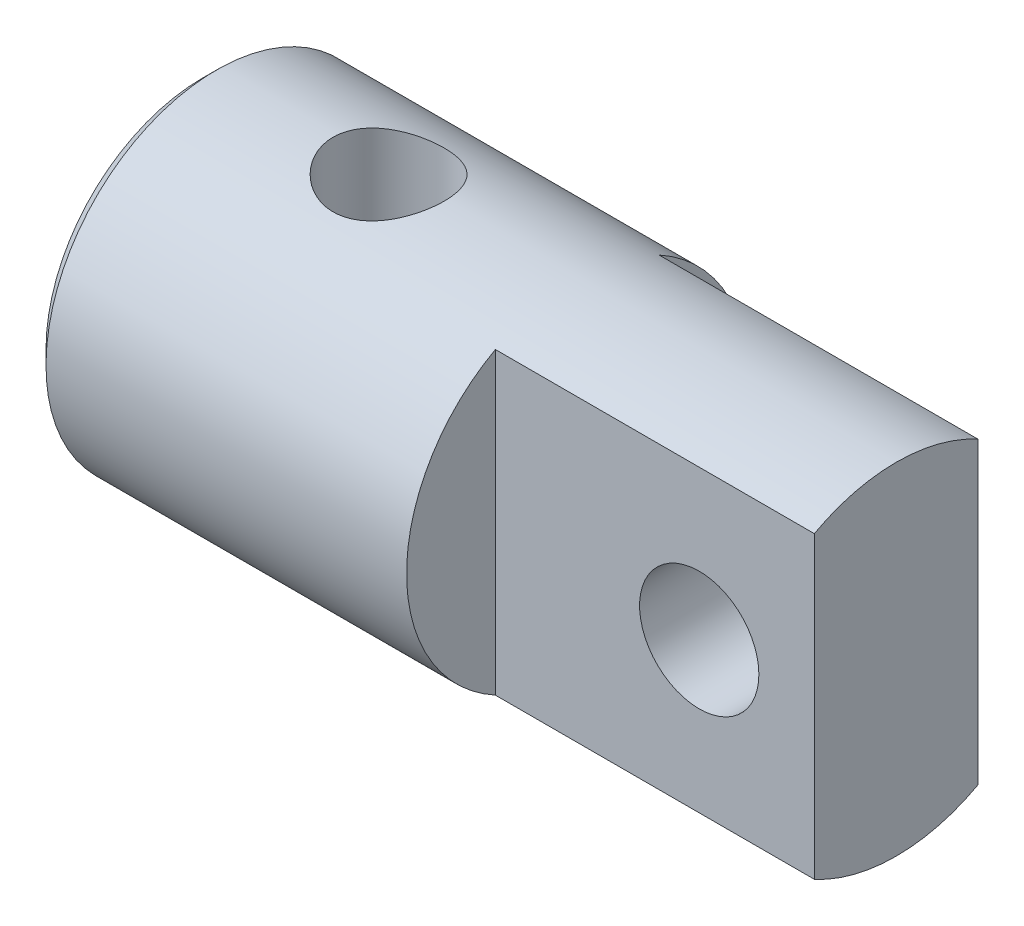
ISO-10303-21;
HEADER;
FILE_DESCRIPTION(('STEP AP214'),'2;1');
FILE_NAME('part.step','',(''),(''),'','','');
FILE_SCHEMA(('AUTOMOTIVE_DESIGN { 1 0 10303 214 1 1 1 1 }'));
ENDSEC;
DATA;
#1=APPLICATION_CONTEXT('core data for automotive mechanical design processes');
#2=APPLICATION_PROTOCOL_DEFINITION('international standard','automotive_design',2000,#1);
#3=PRODUCT_CONTEXT('',#1,'mechanical');
#4=PRODUCT('Part','Part','',(#3));
#5=PRODUCT_RELATED_PRODUCT_CATEGORY('part','',(#4));
#6=PRODUCT_DEFINITION_FORMATION('','',#4);
#7=PRODUCT_DEFINITION_CONTEXT('part definition',#1,'design');
#8=PRODUCT_DEFINITION('design','',#6,#7);
#9=PRODUCT_DEFINITION_SHAPE('','',#8);
#10=(LENGTH_UNIT() NAMED_UNIT(*) SI_UNIT(.MILLI.,.METRE.));
#11=(NAMED_UNIT(*) PLANE_ANGLE_UNIT() SI_UNIT($,.RADIAN.));
#12=(NAMED_UNIT(*) SI_UNIT($,.STERADIAN.) SOLID_ANGLE_UNIT());
#13=UNCERTAINTY_MEASURE_WITH_UNIT(LENGTH_MEASURE(1.E-05),#10,'distance_accuracy_value','');
#14=(GEOMETRIC_REPRESENTATION_CONTEXT(3) GLOBAL_UNCERTAINTY_ASSIGNED_CONTEXT((#13)) GLOBAL_UNIT_ASSIGNED_CONTEXT((#10,
#11,#12)) REPRESENTATION_CONTEXT('',''));
#15=CARTESIAN_POINT('',(0.,0.,0.));
#16=DIRECTION('',(0.,0.,1.));
#17=DIRECTION('',(1.,0.,0.));
#18=AXIS2_PLACEMENT_3D('',#15,#16,#17);
#19=CARTESIAN_POINT('',(0.,0.,0.));
#20=DIRECTION('',(-1.,0.,0.));
#21=DIRECTION('',(0.,-1.,0.));
#22=AXIS2_PLACEMENT_3D('',#19,#20,#21);
#23=PLANE('',#22);
#24=CARTESIAN_POINT('',(0.,0.,0.));
#25=DIRECTION('',(-1.,0.,0.));
#26=DIRECTION('',(0.,-1.,0.));
#27=AXIS2_PLACEMENT_3D('',#24,#25,#26);
#28=CIRCLE('',#27,5.65000000000001);
#29=CARTESIAN_POINT('',(0.,-5.65000000000001,0.));
#30=VERTEX_POINT('',#29);
#31=EDGE_CURVE('E110',#30,#30,#28,.T.);
#32=ORIENTED_EDGE('',*,*,#31,.T.);
#33=EDGE_LOOP('',(#32));
#34=FACE_BOUND('',#33,.T.);
#35=ADVANCED_FACE('F45',(#34),#23,.T.);
#36=CARTESIAN_POINT('',(25.,0.,0.));
#37=DIRECTION('',(1.,0.,0.));
#38=DIRECTION('',(0.,1.,0.));
#39=AXIS2_PLACEMENT_3D('',#36,#37,#38);
#40=CYLINDRICAL_SURFACE('',#39,6.15);
#41=DIRECTION('',(1.,0.,0.));
#42=VECTOR('',#41,1.);
#43=CARTESIAN_POINT('',(25.,-5.39629502529282,2.95));
#44=LINE('',#43,#42);
#45=CARTESIAN_POINT('',(13.5,-5.39629502529282,2.95));
#46=VERTEX_POINT('',#45);
#47=CARTESIAN_POINT('',(25.,-5.39629502529282,2.95));
#48=VERTEX_POINT('',#47);
#49=EDGE_CURVE('E70',#46,#48,#44,.T.);
#50=ORIENTED_EDGE('',*,*,#49,.F.);
#51=CARTESIAN_POINT('',(13.5,0.,0.));
#52=DIRECTION('',(-1.,0.,0.));
#53=DIRECTION('',(0.,0.,1.));
#54=AXIS2_PLACEMENT_3D('',#51,#52,#53);
#55=CIRCLE('',#54,6.15);
#56=CARTESIAN_POINT('',(13.5,5.39629502529282,2.95));
#57=VERTEX_POINT('',#56);
#58=EDGE_CURVE('E11',#57,#46,#55,.F.);
#59=ORIENTED_EDGE('',*,*,#58,.F.);
#60=DIRECTION('',(1.,0.,0.));
#61=VECTOR('',#60,1.);
#62=CARTESIAN_POINT('',(25.,5.39629502529282,2.95));
#63=LINE('',#62,#61);
#64=CARTESIAN_POINT('',(25.,5.39629502529282,2.95));
#65=VERTEX_POINT('',#64);
#66=EDGE_CURVE('E112',#65,#57,#63,.F.);
#67=ORIENTED_EDGE('',*,*,#66,.F.);
#68=CARTESIAN_POINT('',(25.,0.,0.));
#69=DIRECTION('',(1.,0.,0.));
#70=DIRECTION('',(0.,1.,0.));
#71=AXIS2_PLACEMENT_3D('',#68,#69,#70);
#72=CIRCLE('',#71,6.15);
#73=CARTESIAN_POINT('',(25.,5.39629502529282,-2.95));
#74=VERTEX_POINT('',#73);
#75=EDGE_CURVE('E107',#74,#65,#72,.T.);
#76=ORIENTED_EDGE('',*,*,#75,.F.);
#77=DIRECTION('',(1.,0.,0.));
#78=VECTOR('',#77,1.);
#79=CARTESIAN_POINT('',(25.,5.39629502529282,-2.95));
#80=LINE('',#79,#78);
#81=CARTESIAN_POINT('',(13.5,5.39629502529282,-2.95));
#82=VERTEX_POINT('',#81);
#83=EDGE_CURVE('E62',#82,#74,#80,.T.);
#84=ORIENTED_EDGE('',*,*,#83,.F.);
#85=CARTESIAN_POINT('',(13.5,0.,0.));
#86=DIRECTION('',(-1.,0.,0.));
#87=DIRECTION('',(0.,0.,1.));
#88=AXIS2_PLACEMENT_3D('',#85,#86,#87);
#89=CIRCLE('',#88,6.15);
#90=CARTESIAN_POINT('',(13.5,-5.39629502529282,-2.95));
#91=VERTEX_POINT('',#90);
#92=EDGE_CURVE('E55',#91,#82,#89,.F.);
#93=ORIENTED_EDGE('',*,*,#92,.F.);
#94=DIRECTION('',(1.,0.,0.));
#95=VECTOR('',#94,1.);
#96=CARTESIAN_POINT('',(25.,-5.39629502529282,-2.95));
#97=LINE('',#96,#95);
#98=CARTESIAN_POINT('',(25.,-5.39629502529282,-2.95));
#99=VERTEX_POINT('',#98);
#100=EDGE_CURVE('E90',#99,#91,#97,.F.);
#101=ORIENTED_EDGE('',*,*,#100,.F.);
#102=EDGE_CURVE('E103',#48,#99,#72,.T.);
#103=ORIENTED_EDGE('',*,*,#102,.F.);
#104=EDGE_LOOP('',(#50,#59,#67,#76,#84,#93,#101,#103));
#105=FACE_BOUND('',#104,.T.);
#106=CARTESIAN_POINT('',(8.7,-6.15,0.));
#107=CARTESIAN_POINT('',(8.69999999918456,-6.14999994316743,0.109275930693207));
#108=CARTESIAN_POINT('',(8.69101478689947,-6.14706039441532,0.218553009042241));
#109=CARTESIAN_POINT('',(8.65541503422324,-6.13562287657913,0.433897501147324));
#110=CARTESIAN_POINT('',(8.62879781509903,-6.12712406290922,0.53996442464157));
#111=CARTESIAN_POINT('',(8.55893653391903,-6.10549346049692,0.74575269807193));
#112=CARTESIAN_POINT('',(8.51571945591907,-6.09236919354333,0.845484041831606));
#113=CARTESIAN_POINT('',(8.4140043636421,-6.06283340640146,1.03628368026971));
#114=CARTESIAN_POINT('',(8.35550356817236,-6.0464212880466,1.12735039411839));
#115=CARTESIAN_POINT('',(8.22284275944753,-6.01143433741961,1.3012551696699));
#116=CARTESIAN_POINT('',(8.14826704611278,-5.99280953302418,1.38376601647632));
#117=CARTESIAN_POINT('',(7.9864576449676,-5.95577695826563,1.53535728777871));
#118=CARTESIAN_POINT('',(7.89922135258385,-5.93736923340537,1.60443494189804));
#119=CARTESIAN_POINT('',(7.71166633233093,-5.90231062733656,1.72902938898497));
#120=CARTESIAN_POINT('',(7.61105688801193,-5.88572095776574,1.78412743394196));
#121=CARTESIAN_POINT('',(7.40137312502201,-5.85693336531154,1.8764830969112));
#122=CARTESIAN_POINT('',(7.29230125851232,-5.84473417593086,1.91374586079228));
#123=CARTESIAN_POINT('',(7.07249874973717,-5.82663358868171,1.96815764676601));
#124=CARTESIAN_POINT('',(6.96193545195018,-5.82054151688846,1.98591741077448));
#125=CARTESIAN_POINT('',(6.73924348532818,-5.81478008345407,2.00272787957908));
#126=CARTESIAN_POINT('',(6.62711528241434,-5.8151088492414,2.00178403908881));
#127=CARTESIAN_POINT('',(6.40962198592103,-5.82198436694731,1.98168966805447));
#128=CARTESIAN_POINT('',(6.30417404880946,-5.82826175034559,1.96332783188451));
#129=CARTESIAN_POINT('',(6.09794562726857,-5.84588769045731,1.91020219381234));
#130=CARTESIAN_POINT('',(5.99716567800798,-5.85723682704939,1.87543651635236));
#131=CARTESIAN_POINT('',(5.80130771909277,-5.88392515838721,1.78995778071209));
#132=CARTESIAN_POINT('',(5.70634251897686,-5.8993235618603,1.73900552496647));
#133=CARTESIAN_POINT('',(5.52605698035539,-5.93234968935044,1.62276604270421));
#134=CARTESIAN_POINT('',(5.44073932840769,-5.94997803145844,1.55747483803217));
#135=CARTESIAN_POINT('',(5.27772799931394,-5.98654582877886,1.41059024512933));
#136=CARTESIAN_POINT('',(5.20062133154496,-6.00550697474612,1.32834952791472));
#137=CARTESIAN_POINT('',(5.06114501651304,-6.04183756472134,1.15187012886872));
#138=CARTESIAN_POINT('',(4.99877664963257,-6.05920687035879,1.05763040572332));
#139=CARTESIAN_POINT('',(4.89010485796254,-6.09060599620488,0.858628416343221));
#140=CARTESIAN_POINT('',(4.84395183230819,-6.10460419203387,0.753778689161372));
#141=CARTESIAN_POINT('',(4.77011773496595,-6.12745488449761,0.537240584659712));
#142=CARTESIAN_POINT('',(4.74243056876684,-6.13630907874501,0.425554476933183));
#143=CARTESIAN_POINT('',(4.70733814809986,-6.14759610653883,0.20348867170941));
#144=CARTESIAN_POINT('',(4.69913911953971,-6.15028010120748,0.0932470028804535));
#145=CARTESIAN_POINT('',(4.70100375189134,-6.14967343730454,-0.127054581731222));
#146=CARTESIAN_POINT('',(4.71106449693912,-6.14638373266011,-0.23711452372445));
#147=CARTESIAN_POINT('',(4.74853121045614,-6.13436483244421,-0.450797306096235));
#148=CARTESIAN_POINT('',(4.77545588326652,-6.12578667244889,-0.554513859273324));
#149=CARTESIAN_POINT('',(4.84529017306788,-6.10420761917996,-0.755921041977586));
#150=CARTESIAN_POINT('',(4.88820180697218,-6.09120616788237,-0.853610909365379));
#151=CARTESIAN_POINT('',(4.99001294648456,-6.06169349098342,-1.04297447933711));
#152=CARTESIAN_POINT('',(5.04929331544958,-6.04510099840299,-1.13443038855414));
#153=CARTESIAN_POINT('',(5.18170804542634,-6.01029415808353,-1.30635793269386));
#154=CARTESIAN_POINT('',(5.25484645353588,-5.99207933738582,-1.38682634699));
#155=CARTESIAN_POINT('',(5.41663526873055,-5.95508777066157,-1.5381026394857));
#156=CARTESIAN_POINT('',(5.50581862083697,-5.93632066803884,-1.60834423598373));
#157=CARTESIAN_POINT('',(5.69511199380083,-5.9011582089238,-1.73292705476389));
#158=CARTESIAN_POINT('',(5.79522199014971,-5.88476284711185,-1.78726831270961));
#159=CARTESIAN_POINT('',(6.00346269545166,-5.85637042602916,-1.87821793059078));
#160=CARTESIAN_POINT('',(6.11156968578748,-5.84436094149838,-1.9148764820769));
#161=CARTESIAN_POINT('',(6.33289908993628,-5.82624486525908,-1.96931713943731));
#162=CARTESIAN_POINT('',(6.44611932332632,-5.82013578188197,-1.98710721355488));
#163=CARTESIAN_POINT('',(6.66850124748932,-5.81478627230482,-2.00270348035457));
#164=CARTESIAN_POINT('',(6.77759035746587,-5.81522429976815,-2.00144515117492));
#165=CARTESIAN_POINT('',(6.99391803096077,-5.82213014541404,-1.98126517189426));
#166=CARTESIAN_POINT('',(7.10115669444375,-5.8285976368283,-1.9623444790094));
#167=CARTESIAN_POINT('',(7.30891359055838,-5.84659998232017,-1.90802517500685));
#168=CARTESIAN_POINT('',(7.40951566707675,-5.85804580286302,-1.87291545709127));
#169=CARTESIAN_POINT('',(7.60347977422412,-5.88468617459773,-1.78744596070577));
#170=CARTESIAN_POINT('',(7.69684024310082,-5.89988153149055,-1.7370829040664));
#171=CARTESIAN_POINT('',(7.8779062159699,-5.93310236799994,-1.62007323988053));
#172=CARTESIAN_POINT('',(7.96521121520167,-5.95121971302379,-1.55283307636114));
#173=CARTESIAN_POINT('',(8.12760110862251,-5.98784382663959,-1.40499751231745));
#174=CARTESIAN_POINT('',(8.20268261216619,-6.00635070168013,-1.32439841866179));
#175=CARTESIAN_POINT('',(8.34124251163947,-6.04247740884059,-1.14860592719474));
#176=CARTESIAN_POINT('',(8.40419887035284,-6.06004040500971,-1.0529879829512));
#177=CARTESIAN_POINT('',(8.51306951147034,-6.0915511319482,-0.851959033671659));
#178=CARTESIAN_POINT('',(8.55898910008644,-6.10549998795586,-0.746551090604265));
#179=CARTESIAN_POINT('',(8.62998889389919,-6.12750250239647,-0.535515183546198));
#180=CARTESIAN_POINT('',(8.65616243720957,-6.1358619381303,-0.430286887521659));
#181=CARTESIAN_POINT('',(8.6911658666282,-6.14711004512017,-0.21670558915028));
#182=CARTESIAN_POINT('',(8.70000000080856,-6.15000005635276,-0.108353358754766));
#183=CARTESIAN_POINT('',(8.7,-6.15,0.));
#184=B_SPLINE_CURVE_WITH_KNOTS('',3,(#106,#107,#108,#109,#110,#111,#112,#113,#114,#115,#116,
#117,#118,#119,#120,#121,#122,#123,#124,#125,#126,#127,#128,#129,#130,#131,#132,#133,#134,#135,
#136,#137,#138,#139,#140,#141,#142,#143,#144,#145,#146,#147,#148,#149,#150,#151,#152,#153,#154,
#155,#156,#157,#158,#159,#160,#161,#162,#163,#164,#165,#166,#167,#168,#169,#170,#171,#172,#173,
#174,#175,#176,#177,#178,#179,#180,#181,#182,#183),.UNSPECIFIED.,.T.,.F.,(4,2,2,2,2,2,2,2,2,2,2,
2,2,2,2,2,2,2,2,2,2,2,2,2,2,2,2,2,2,2,2,2,2,2,2,2,2,2,4),(0.,0.327429241558711,
0.654908239039127,0.981857137585752,1.30886557282721,1.64564590746146,1.98249562405249,
2.32848403735761,2.67437256517015,3.00908998892277,3.34370979722347,3.66386663909209,
3.98406009544642,4.30922442381609,4.63447907903296,4.97584543559233,5.31724143728842,
5.66172515239416,6.00609511703097,6.33617834333708,6.66620886399989,6.98722451861792,
7.30828068625916,7.63754882455277,7.96691327084462,8.31048192972342,8.65404981799052,
8.99663668064053,9.33907880963433,9.66476038654692,9.990424314091,10.3104891889731,
10.630622899429,10.9641620680002,11.2977935991217,11.6435733073037,11.9892452295767,
12.3139896908906,12.6386545814329),.UNSPECIFIED.);
#185=CARTESIAN_POINT('',(8.7,-6.15,0.));
#186=VERTEX_POINT('',#185);
#187=EDGE_CURVE('E97',#186,#186,#184,.T.);
#188=ORIENTED_EDGE('',*,*,#187,.F.);
#189=EDGE_LOOP('',(#188));
#190=FACE_BOUND('',#189,.T.);
#191=CARTESIAN_POINT('',(4.7,6.15,0.));
#192=CARTESIAN_POINT('',(4.70000000081544,6.14999994316743,0.109275930693207));
#193=CARTESIAN_POINT('',(4.70898521310053,6.14706039441532,0.218553009042241));
#194=CARTESIAN_POINT('',(4.74458496577676,6.13562287657913,0.433897501147324));
#195=CARTESIAN_POINT('',(4.77120218490097,6.12712406290922,0.53996442464157));
#196=CARTESIAN_POINT('',(4.84106346608097,6.10549346049692,0.74575269807193));
#197=CARTESIAN_POINT('',(4.88428054408093,6.09236919354333,0.845484041831605));
#198=CARTESIAN_POINT('',(4.9859956363579,6.06283340640146,1.03628368026971));
#199=CARTESIAN_POINT('',(5.04449643182763,6.0464212880466,1.12735039411839));
#200=CARTESIAN_POINT('',(5.17715724055247,6.01143433741961,1.3012551696699));
#201=CARTESIAN_POINT('',(5.25173295388722,5.99280953302417,1.38376601647632));
#202=CARTESIAN_POINT('',(5.4135423550324,5.95577695826563,1.53535728777871));
#203=CARTESIAN_POINT('',(5.50077864741615,5.93736923340537,1.60443494189804));
#204=CARTESIAN_POINT('',(5.68833366766907,5.90231062733656,1.72902938898497));
#205=CARTESIAN_POINT('',(5.78894311198807,5.88572095776574,1.78412743394196));
#206=CARTESIAN_POINT('',(5.99862687497799,5.85693336531154,1.8764830969112));
#207=CARTESIAN_POINT('',(6.10769874148768,5.84473417593086,1.91374586079228));
#208=CARTESIAN_POINT('',(6.32750125026283,5.82663358868171,1.96815764676601));
#209=CARTESIAN_POINT('',(6.43806454804982,5.82054151688846,1.98591741077448));
#210=CARTESIAN_POINT('',(6.66075651467182,5.81478008345407,2.00272787957908));
#211=CARTESIAN_POINT('',(6.77288471758566,5.8151088492414,2.00178403908881));
#212=CARTESIAN_POINT('',(6.99037801407897,5.82198436694731,1.98168966805447));
#213=CARTESIAN_POINT('',(7.09582595119054,5.82826175034559,1.96332783188451));
#214=CARTESIAN_POINT('',(7.30205437273143,5.84588769045731,1.91020219381234));
#215=CARTESIAN_POINT('',(7.40283432199202,5.85723682704939,1.87543651635236));
#216=CARTESIAN_POINT('',(7.59869228090723,5.88392515838721,1.78995778071209));
#217=CARTESIAN_POINT('',(7.69365748102314,5.8993235618603,1.73900552496647));
#218=CARTESIAN_POINT('',(7.87394301964461,5.93234968935044,1.62276604270421));
#219=CARTESIAN_POINT('',(7.95926067159231,5.94997803145844,1.55747483803217));
#220=CARTESIAN_POINT('',(8.12227200068606,5.98654582877886,1.41059024512933));
#221=CARTESIAN_POINT('',(8.19937866845504,6.00550697474612,1.32834952791472));
#222=CARTESIAN_POINT('',(8.33885498348696,6.04183756472134,1.15187012886872));
#223=CARTESIAN_POINT('',(8.40122335036743,6.05920687035879,1.05763040572332));
#224=CARTESIAN_POINT('',(8.50989514203746,6.09060599620488,0.858628416343221));
#225=CARTESIAN_POINT('',(8.55604816769181,6.10460419203387,0.753778689161372));
#226=CARTESIAN_POINT('',(8.62988226503405,6.12745488449761,0.537240584659712));
#227=CARTESIAN_POINT('',(8.65756943123317,6.13630907874501,0.425554476933183));
#228=CARTESIAN_POINT('',(8.69266185190014,6.14759610653883,0.20348867170941));
#229=CARTESIAN_POINT('',(8.70086088046029,6.15028010120748,0.0932470028804535));
#230=CARTESIAN_POINT('',(8.69899624810866,6.14967343730454,-0.127054581731222));
#231=CARTESIAN_POINT('',(8.68893550306088,6.14638373266011,-0.23711452372445));
#232=CARTESIAN_POINT('',(8.65146878954386,6.13436483244421,-0.450797306096234));
#233=CARTESIAN_POINT('',(8.62454411673347,6.12578667244889,-0.554513859273324));
#234=CARTESIAN_POINT('',(8.55470982693212,6.10420761917996,-0.755921041977586));
#235=CARTESIAN_POINT('',(8.51179819302782,6.09120616788237,-0.853610909365378));
#236=CARTESIAN_POINT('',(8.40998705351544,6.06169349098342,-1.04297447933711));
#237=CARTESIAN_POINT('',(8.35070668455042,6.04510099840299,-1.13443038855414));
#238=CARTESIAN_POINT('',(8.21829195457367,6.01029415808353,-1.30635793269386));
#239=CARTESIAN_POINT('',(8.14515354646412,5.99207933738582,-1.38682634699));
#240=CARTESIAN_POINT('',(7.98336473126945,5.95508777066157,-1.5381026394857));
#241=CARTESIAN_POINT('',(7.89418137916303,5.93632066803884,-1.60834423598373));
#242=CARTESIAN_POINT('',(7.70488800619917,5.9011582089238,-1.73292705476389));
#243=CARTESIAN_POINT('',(7.60477800985029,5.88476284711185,-1.78726831270961));
#244=CARTESIAN_POINT('',(7.39653730454834,5.85637042602916,-1.87821793059078));
#245=CARTESIAN_POINT('',(7.28843031421252,5.84436094149838,-1.9148764820769));
#246=CARTESIAN_POINT('',(7.06710091006372,5.82624486525909,-1.96931713943731));
#247=CARTESIAN_POINT('',(6.95388067667368,5.82013578188197,-1.98710721355488));
#248=CARTESIAN_POINT('',(6.73149875251069,5.81478627230482,-2.00270348035457));
#249=CARTESIAN_POINT('',(6.62240964253413,5.81522429976815,-2.00144515117492));
#250=CARTESIAN_POINT('',(6.40608196903923,5.82213014541404,-1.98126517189426));
#251=CARTESIAN_POINT('',(6.29884330555625,5.8285976368283,-1.9623444790094));
#252=CARTESIAN_POINT('',(6.09108640944162,5.84659998232017,-1.90802517500685));
#253=CARTESIAN_POINT('',(5.99048433292325,5.85804580286302,-1.87291545709127));
#254=CARTESIAN_POINT('',(5.79652022577588,5.88468617459773,-1.78744596070577));
#255=CARTESIAN_POINT('',(5.70315975689918,5.89988153149055,-1.7370829040664));
#256=CARTESIAN_POINT('',(5.52209378403011,5.93310236799994,-1.62007323988053));
#257=CARTESIAN_POINT('',(5.43478878479833,5.95121971302379,-1.55283307636114));
#258=CARTESIAN_POINT('',(5.27239889137749,5.98784382663959,-1.40499751231746));
#259=CARTESIAN_POINT('',(5.19731738783381,6.00635070168013,-1.32439841866179));
#260=CARTESIAN_POINT('',(5.05875748836054,6.04247740884059,-1.14860592719474));
#261=CARTESIAN_POINT('',(4.99580112964717,6.06004040500971,-1.0529879829512));
#262=CARTESIAN_POINT('',(4.88693048852966,6.0915511319482,-0.851959033671659));
#263=CARTESIAN_POINT('',(4.84101089991356,6.10549998795586,-0.746551090604265));
#264=CARTESIAN_POINT('',(4.77001110610081,6.12750250239647,-0.535515183546198));
#265=CARTESIAN_POINT('',(4.74383756279043,6.1358619381303,-0.430286887521658));
#266=CARTESIAN_POINT('',(4.7088341333718,6.14711004512016,-0.216705589150279));
#267=CARTESIAN_POINT('',(4.69999999919145,6.15000005635276,-0.108353358754766));
#268=CARTESIAN_POINT('',(4.7,6.15,0.));
#269=B_SPLINE_CURVE_WITH_KNOTS('',3,(#191,#192,#193,#194,#195,#196,#197,#198,#199,#200,#201,
#202,#203,#204,#205,#206,#207,#208,#209,#210,#211,#212,#213,#214,#215,#216,#217,#218,#219,#220,
#221,#222,#223,#224,#225,#226,#227,#228,#229,#230,#231,#232,#233,#234,#235,#236,#237,#238,#239,
#240,#241,#242,#243,#244,#245,#246,#247,#248,#249,#250,#251,#252,#253,#254,#255,#256,#257,#258,
#259,#260,#261,#262,#263,#264,#265,#266,#267,#268),.UNSPECIFIED.,.T.,.F.,(4,2,2,2,2,2,2,2,2,2,2,
2,2,2,2,2,2,2,2,2,2,2,2,2,2,2,2,2,2,2,2,2,2,2,2,2,2,2,4),(0.,0.327429241558711,
0.654908239039127,0.981857137585751,1.30886557282721,1.64564590746146,1.9824956240525,
2.32848403735761,2.67437256517015,3.00908998892277,3.34370979722347,3.66386663909209,
3.98406009544642,4.30922442381609,4.63447907903296,4.97584543559233,5.31724143728842,
5.66172515239416,6.00609511703097,6.33617834333708,6.66620886399989,6.98722451861792,
7.30828068625916,7.63754882455277,7.96691327084462,8.31048192972342,8.65404981799053,
8.99663668064054,9.33907880963433,9.66476038654692,9.990424314091,10.3104891889731,
10.630622899429,10.9641620680002,11.2977935991217,11.6435733073037,11.9892452295767,
12.3139896908906,12.6386545814329),.UNSPECIFIED.);
#270=CARTESIAN_POINT('',(4.7,6.15,0.));
#271=VERTEX_POINT('',#270);
#272=EDGE_CURVE('E118',#271,#271,#269,.T.);
#273=ORIENTED_EDGE('',*,*,#272,.F.);
#274=EDGE_LOOP('',(#273));
#275=FACE_BOUND('',#274,.T.);
#276=CARTESIAN_POINT('',(0.499999999999997,0.,0.));
#277=DIRECTION('',(-1.,0.,0.));
#278=DIRECTION('',(0.,-1.,0.));
#279=AXIS2_PLACEMENT_3D('',#276,#277,#278);
#280=CIRCLE('',#279,6.15);
#281=CARTESIAN_POINT('',(0.499999999999997,-6.15,0.));
#282=VERTEX_POINT('',#281);
#283=EDGE_CURVE('E106',#282,#282,#280,.F.);
#284=ORIENTED_EDGE('',*,*,#283,.T.);
#285=EDGE_LOOP('',(#284));
#286=FACE_BOUND('',#285,.T.);
#287=ADVANCED_FACE('F101',(#105,#190,#275,#286),#40,.T.);
#288=CARTESIAN_POINT('',(25.,6.15,0.));
#289=DIRECTION('',(1.,0.,0.));
#290=DIRECTION('',(0.,1.,0.));
#291=AXIS2_PLACEMENT_3D('',#288,#289,#290);
#292=PLANE('',#291);
#293=DIRECTION('',(0.,1.,0.));
#294=VECTOR('',#293,1.);
#295=CARTESIAN_POINT('',(25.,6.15,2.95));
#296=LINE('',#295,#294);
#297=EDGE_CURVE('E96',#48,#65,#296,.T.);
#298=ORIENTED_EDGE('',*,*,#297,.F.);
#299=ORIENTED_EDGE('',*,*,#102,.T.);
#300=DIRECTION('',(0.,-1.,0.));
#301=VECTOR('',#300,1.);
#302=CARTESIAN_POINT('',(25.,6.15,-2.95));
#303=LINE('',#302,#301);
#304=EDGE_CURVE('E87',#74,#99,#303,.T.);
#305=ORIENTED_EDGE('',*,*,#304,.F.);
#306=ORIENTED_EDGE('',*,*,#75,.T.);
#307=EDGE_LOOP('',(#298,#299,#305,#306));
#308=FACE_BOUND('',#307,.T.);
#309=ADVANCED_FACE('F105',(#308),#292,.T.);
#310=CARTESIAN_POINT('',(0.499999999999997,0.,0.));
#311=DIRECTION('',(1.,0.,0.));
#312=DIRECTION('',(0.,1.,0.));
#313=AXIS2_PLACEMENT_3D('',#310,#311,#312);
#314=CONICAL_SURFACE('',#313,6.15,0.785398163397447);
#315=ORIENTED_EDGE('',*,*,#31,.F.);
#316=EDGE_LOOP('',(#315));
#317=FACE_BOUND('',#316,.T.);
#318=ORIENTED_EDGE('',*,*,#283,.F.);
#319=EDGE_LOOP('',(#318));
#320=FACE_BOUND('',#319,.T.);
#321=ADVANCED_FACE('F48',(#317,#320),#314,.T.);
#322=CARTESIAN_POINT('',(6.7,-6.15,0.));
#323=DIRECTION('',(0.,1.,0.));
#324=DIRECTION('',(0.,0.,1.));
#325=AXIS2_PLACEMENT_3D('',#322,#323,#324);
#326=CYLINDRICAL_SURFACE('',#325,2.);
#327=ORIENTED_EDGE('',*,*,#272,.T.);
#328=EDGE_LOOP('',(#327));
#329=FACE_BOUND('',#328,.T.);
#330=ORIENTED_EDGE('',*,*,#187,.T.);
#331=EDGE_LOOP('',(#330));
#332=FACE_BOUND('',#331,.T.);
#333=ADVANCED_FACE('F131',(#329,#332),#326,.F.);
#334=CARTESIAN_POINT('',(13.5,-6.15,-6.15));
#335=DIRECTION('',(-1.,0.,0.));
#336=DIRECTION('',(0.,0.,1.));
#337=AXIS2_PLACEMENT_3D('',#334,#335,#336);
#338=PLANE('',#337);
#339=DIRECTION('',(0.,1.,0.));
#340=VECTOR('',#339,1.);
#341=CARTESIAN_POINT('',(13.5,-6.15,-2.95));
#342=LINE('',#341,#340);
#343=EDGE_CURVE('E230',#91,#82,#342,.T.);
#344=ORIENTED_EDGE('',*,*,#343,.F.);
#345=ORIENTED_EDGE('',*,*,#92,.T.);
#346=EDGE_LOOP('',(#344,#345));
#347=FACE_BOUND('',#346,.T.);
#348=ADVANCED_FACE('F135',(#347),#338,.F.);
#349=CARTESIAN_POINT('',(13.5,-6.15,-2.95));
#350=DIRECTION('',(0.,0.,1.));
#351=DIRECTION('',(1.,0.,0.));
#352=AXIS2_PLACEMENT_3D('',#349,#350,#351);
#353=PLANE('',#352);
#354=CARTESIAN_POINT('',(20.85,0.,-2.95));
#355=DIRECTION('',(0.,0.,1.));
#356=DIRECTION('',(1.,0.,0.));
#357=AXIS2_PLACEMENT_3D('',#354,#355,#356);
#358=CIRCLE('',#357,2.15);
#359=CARTESIAN_POINT('',(23.,0.,-2.95));
#360=VERTEX_POINT('',#359);
#361=EDGE_CURVE('E229',#360,#360,#358,.T.);
#362=ORIENTED_EDGE('',*,*,#361,.T.);
#363=EDGE_LOOP('',(#362));
#364=FACE_BOUND('',#363,.T.);
#365=ORIENTED_EDGE('',*,*,#100,.T.);
#366=ORIENTED_EDGE('',*,*,#343,.T.);
#367=ORIENTED_EDGE('',*,*,#83,.T.);
#368=ORIENTED_EDGE('',*,*,#304,.T.);
#369=EDGE_LOOP('',(#365,#366,#367,#368));
#370=FACE_BOUND('',#369,.T.);
#371=ADVANCED_FACE('F89',(#364,#370),#353,.F.);
#372=CARTESIAN_POINT('',(13.5,-6.15,6.15));
#373=DIRECTION('',(-1.,0.,0.));
#374=DIRECTION('',(0.,0.,1.));
#375=AXIS2_PLACEMENT_3D('',#372,#373,#374);
#376=PLANE('',#375);
#377=ORIENTED_EDGE('',*,*,#58,.T.);
#378=DIRECTION('',(0.,1.,0.));
#379=VECTOR('',#378,1.);
#380=CARTESIAN_POINT('',(13.5,-6.15,2.95));
#381=LINE('',#380,#379);
#382=EDGE_CURVE('E232',#46,#57,#381,.T.);
#383=ORIENTED_EDGE('',*,*,#382,.T.);
#384=EDGE_LOOP('',(#377,#383));
#385=FACE_BOUND('',#384,.T.);
#386=ADVANCED_FACE('F190',(#385),#376,.F.);
#387=CARTESIAN_POINT('',(13.5,-6.15,2.95));
#388=DIRECTION('',(0.,0.,-1.));
#389=DIRECTION('',(-1.,0.,0.));
#390=AXIS2_PLACEMENT_3D('',#387,#388,#389);
#391=PLANE('',#390);
#392=CARTESIAN_POINT('',(20.85,0.,2.95));
#393=DIRECTION('',(0.,0.,-1.));
#394=DIRECTION('',(-1.,0.,0.));
#395=AXIS2_PLACEMENT_3D('',#392,#393,#394);
#396=CIRCLE('',#395,2.15);
#397=CARTESIAN_POINT('',(23.,0.,2.95));
#398=VERTEX_POINT('',#397);
#399=EDGE_CURVE('E50',#398,#398,#396,.T.);
#400=ORIENTED_EDGE('',*,*,#399,.T.);
#401=EDGE_LOOP('',(#400));
#402=FACE_BOUND('',#401,.T.);
#403=ORIENTED_EDGE('',*,*,#66,.T.);
#404=ORIENTED_EDGE('',*,*,#382,.F.);
#405=ORIENTED_EDGE('',*,*,#49,.T.);
#406=ORIENTED_EDGE('',*,*,#297,.T.);
#407=EDGE_LOOP('',(#403,#404,#405,#406));
#408=FACE_BOUND('',#407,.T.);
#409=ADVANCED_FACE('F198',(#402,#408),#391,.F.);
#410=CARTESIAN_POINT('',(20.85,0.,-6.15));
#411=DIRECTION('',(0.,0.,1.));
#412=DIRECTION('',(1.,0.,0.));
#413=AXIS2_PLACEMENT_3D('',#410,#411,#412);
#414=CYLINDRICAL_SURFACE('',#413,2.15);
#415=CARTESIAN_POINT('',(23.,0.,2.95));
#416=CARTESIAN_POINT('',(23.,0.,2.88854166666667));
#417=CARTESIAN_POINT('',(23.,0.,2.82708333333333));
#418=CARTESIAN_POINT('',(23.,0.,2.70416666666667));
#419=CARTESIAN_POINT('',(23.,0.,2.64270833333333));
#420=CARTESIAN_POINT('',(23.,0.,2.51979166666667));
#421=CARTESIAN_POINT('',(23.,0.,2.45833333333333));
#422=CARTESIAN_POINT('',(23.,0.,2.33541666666667));
#423=CARTESIAN_POINT('',(23.,0.,2.27395833333333));
#424=CARTESIAN_POINT('',(23.,0.,2.15104166666667));
#425=CARTESIAN_POINT('',(23.,0.,2.08958333333333));
#426=CARTESIAN_POINT('',(23.,0.,1.96666666666667));
#427=CARTESIAN_POINT('',(23.,0.,1.90520833333333));
#428=CARTESIAN_POINT('',(23.,0.,1.78229166666667));
#429=CARTESIAN_POINT('',(23.,0.,1.72083333333333));
#430=CARTESIAN_POINT('',(23.,0.,1.59791666666667));
#431=CARTESIAN_POINT('',(23.,0.,1.53645833333333));
#432=CARTESIAN_POINT('',(23.,0.,1.41354166666667));
#433=CARTESIAN_POINT('',(23.,0.,1.35208333333333));
#434=CARTESIAN_POINT('',(23.,0.,1.22916666666667));
#435=CARTESIAN_POINT('',(23.,0.,1.16770833333333));
#436=CARTESIAN_POINT('',(23.,0.,1.04479166666667));
#437=CARTESIAN_POINT('',(23.,0.,0.983333333333334));
#438=CARTESIAN_POINT('',(23.,0.,0.860416666666667));
#439=CARTESIAN_POINT('',(23.,0.,0.798958333333334));
#440=CARTESIAN_POINT('',(23.,0.,0.676041666666667));
#441=CARTESIAN_POINT('',(23.,0.,0.614583333333334));
#442=CARTESIAN_POINT('',(23.,0.,0.491666666666667));
#443=CARTESIAN_POINT('',(23.,0.,0.430208333333334));
#444=CARTESIAN_POINT('',(23.,0.,0.307291666666667));
#445=CARTESIAN_POINT('',(23.,0.,0.245833333333333));
#446=CARTESIAN_POINT('',(23.,0.,0.122916666666666));
#447=CARTESIAN_POINT('',(23.,0.,0.0614583333333332));
#448=CARTESIAN_POINT('',(23.,0.,-0.0614583333333332));
#449=CARTESIAN_POINT('',(23.,0.,-0.122916666666666));
#450=CARTESIAN_POINT('',(23.,0.,-0.245833333333333));
#451=CARTESIAN_POINT('',(23.,0.,-0.307291666666667));
#452=CARTESIAN_POINT('',(23.,0.,-0.430208333333334));
#453=CARTESIAN_POINT('',(23.,0.,-0.491666666666667));
#454=CARTESIAN_POINT('',(23.,0.,-0.614583333333334));
#455=CARTESIAN_POINT('',(23.,0.,-0.676041666666667));
#456=CARTESIAN_POINT('',(23.,0.,-0.798958333333334));
#457=CARTESIAN_POINT('',(23.,0.,-0.860416666666667));
#458=CARTESIAN_POINT('',(23.,0.,-0.983333333333334));
#459=CARTESIAN_POINT('',(23.,0.,-1.04479166666667));
#460=CARTESIAN_POINT('',(23.,0.,-1.16770833333333));
#461=CARTESIAN_POINT('',(23.,0.,-1.22916666666667));
#462=CARTESIAN_POINT('',(23.,0.,-1.35208333333333));
#463=CARTESIAN_POINT('',(23.,0.,-1.41354166666667));
#464=CARTESIAN_POINT('',(23.,0.,-1.53645833333333));
#465=CARTESIAN_POINT('',(23.,0.,-1.59791666666667));
#466=CARTESIAN_POINT('',(23.,0.,-1.72083333333333));
#467=CARTESIAN_POINT('',(23.,0.,-1.78229166666667));
#468=CARTESIAN_POINT('',(23.,0.,-1.90520833333333));
#469=CARTESIAN_POINT('',(23.,0.,-1.96666666666667));
#470=CARTESIAN_POINT('',(23.,0.,-2.08958333333333));
#471=CARTESIAN_POINT('',(23.,0.,-2.15104166666667));
#472=CARTESIAN_POINT('',(23.,0.,-2.27395833333334));
#473=CARTESIAN_POINT('',(23.,0.,-2.33541666666667));
#474=CARTESIAN_POINT('',(23.,0.,-2.45833333333333));
#475=CARTESIAN_POINT('',(23.,0.,-2.51979166666667));
#476=CARTESIAN_POINT('',(23.,0.,-2.64270833333333));
#477=CARTESIAN_POINT('',(23.,0.,-2.70416666666667));
#478=CARTESIAN_POINT('',(23.,0.,-2.82708333333333));
#479=CARTESIAN_POINT('',(23.,0.,-2.88854166666667));
#480=CARTESIAN_POINT('',(23.,0.,-2.95));
#481=B_SPLINE_CURVE_WITH_KNOTS('',3,(#415,#416,#417,#418,#419,#420,#421,#422,#423,#424,#425,
#426,#427,#428,#429,#430,#431,#432,#433,#434,#435,#436,#437,#438,#439,#440,#441,#442,#443,#444,
#445,#446,#447,#448,#449,#450,#451,#452,#453,#454,#455,#456,#457,#458,#459,#460,#461,#462,#463,
#464,#465,#466,#467,#468,#469,#470,#471,#472,#473,#474,#475,#476,#477,#478,#479,#480),
.UNSPECIFIED.,.F.,.F.,(4,2,2,2,2,2,2,2,2,2,2,2,2,2,2,2,2,2,2,2,2,2,2,2,2,2,2,2,2,2,2,2,4),(0.,
0.184375000000001,0.368750000000001,0.553125,0.7375,0.921875000000001,1.10625,1.290625,1.475,
1.659375,1.84375,2.028125,2.2125,2.396875,2.58125,2.765625,2.95,3.134375,3.31875,3.503125,
3.6875,3.871875,4.05625,4.240625,4.425,4.609375,4.79375,4.978125,5.1625,5.346875,5.53125,
5.715625,5.9),.UNSPECIFIED.);
#482=EDGE_CURVE('BSEAM207',#398,#360,#481,.T.);
#483=ORIENTED_EDGE('',*,*,#399,.F.);
#484=ORIENTED_EDGE('',*,*,#361,.F.);
#485=ORIENTED_EDGE('',*,*,#482,.T.);
#486=ORIENTED_EDGE('',*,*,#482,.F.);
#487=EDGE_LOOP('',(#483,#485,#484,#486));
#488=FACE_BOUND('',#487,.T.);
#489=ADVANCED_FACE('F207',(#488),#414,.F.);
#490=CLOSED_SHELL('',(#35,#287,#309,#321,#333,#348,#371,#386,#409,#489));
#491=MANIFOLD_SOLID_BREP('B2',#490);
#492=ADVANCED_BREP_SHAPE_REPRESENTATION('',(#18,#491),#14);
#493=SHAPE_DEFINITION_REPRESENTATION(#9,#492);
ENDSEC;
END-ISO-10303-21;
